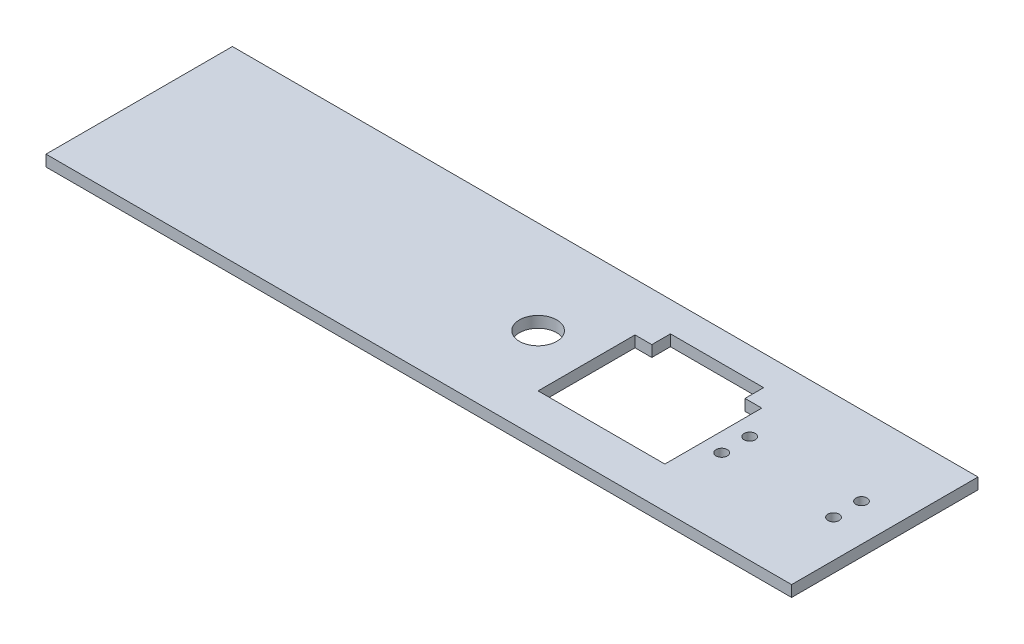
ISO-10303-21;
HEADER;
FILE_DESCRIPTION(('STEP AP214'),'2;1');
FILE_NAME('part.step','',(''),(''),'','','');
FILE_SCHEMA(('AUTOMOTIVE_DESIGN { 1 0 10303 214 1 1 1 1 }'));
ENDSEC;
DATA;
#1=APPLICATION_CONTEXT('core data for automotive mechanical design processes');
#2=APPLICATION_PROTOCOL_DEFINITION('international standard','automotive_design',2000,#1);
#3=PRODUCT_CONTEXT('',#1,'mechanical');
#4=PRODUCT('Part','Part','',(#3));
#5=PRODUCT_RELATED_PRODUCT_CATEGORY('part','',(#4));
#6=PRODUCT_DEFINITION_FORMATION('','',#4);
#7=PRODUCT_DEFINITION_CONTEXT('part definition',#1,'design');
#8=PRODUCT_DEFINITION('design','',#6,#7);
#9=PRODUCT_DEFINITION_SHAPE('','',#8);
#10=(LENGTH_UNIT() NAMED_UNIT(*) SI_UNIT(.MILLI.,.METRE.));
#11=(NAMED_UNIT(*) PLANE_ANGLE_UNIT() SI_UNIT($,.RADIAN.));
#12=(NAMED_UNIT(*) SI_UNIT($,.STERADIAN.) SOLID_ANGLE_UNIT());
#13=UNCERTAINTY_MEASURE_WITH_UNIT(LENGTH_MEASURE(1.E-05),#10,'distance_accuracy_value','');
#14=(GEOMETRIC_REPRESENTATION_CONTEXT(3) GLOBAL_UNCERTAINTY_ASSIGNED_CONTEXT((#13)) GLOBAL_UNIT_ASSIGNED_CONTEXT((#10,
#11,#12)) REPRESENTATION_CONTEXT('',''));
#15=CARTESIAN_POINT('',(0.,0.,0.));
#16=DIRECTION('',(0.,0.,1.));
#17=DIRECTION('',(1.,0.,0.));
#18=AXIS2_PLACEMENT_3D('',#15,#16,#17);
#19=CARTESIAN_POINT('',(26.,-1.5,-12.));
#20=DIRECTION('',(0.,0.,-1.));
#21=DIRECTION('',(-1.,0.,0.));
#22=AXIS2_PLACEMENT_3D('',#19,#20,#21);
#23=PLANE('',#22);
#24=DIRECTION('',(1.,0.,0.));
#25=VECTOR('',#24,1.);
#26=CARTESIAN_POINT('',(0.,1.5,-12.));
#27=LINE('',#26,#25);
#28=CARTESIAN_POINT('',(55.5,1.5,-12.));
#29=VERTEX_POINT('',#28);
#30=CARTESIAN_POINT('',(60.,1.5,-12.));
#31=VERTEX_POINT('',#30);
#32=EDGE_CURVE('E62',#29,#31,#27,.T.);
#33=ORIENTED_EDGE('',*,*,#32,.F.);
#34=DIRECTION('',(0.,1.,0.));
#35=VECTOR('',#34,1.);
#36=CARTESIAN_POINT('',(55.5,-1.5,-12.));
#37=LINE('',#36,#35);
#38=CARTESIAN_POINT('',(55.5,-1.5,-12.));
#39=VERTEX_POINT('',#38);
#40=EDGE_CURVE('E162',#39,#29,#37,.T.);
#41=ORIENTED_EDGE('',*,*,#40,.F.);
#42=DIRECTION('',(-1.,0.,0.));
#43=VECTOR('',#42,1.);
#44=CARTESIAN_POINT('',(26.,-1.5,-12.));
#45=LINE('',#44,#43);
#46=CARTESIAN_POINT('',(60.,-1.5,-12.));
#47=VERTEX_POINT('',#46);
#48=EDGE_CURVE('E156',#47,#39,#45,.T.);
#49=ORIENTED_EDGE('',*,*,#48,.F.);
#50=DIRECTION('',(0.,1.,0.));
#51=VECTOR('',#50,1.);
#52=CARTESIAN_POINT('',(60.,-1.5,-12.));
#53=LINE('',#52,#51);
#54=EDGE_CURVE('E191',#47,#31,#53,.T.);
#55=ORIENTED_EDGE('',*,*,#54,.T.);
#56=EDGE_LOOP('',(#33,#41,#49,#55));
#57=FACE_BOUND('',#56,.T.);
#58=ADVANCED_FACE('F38',(#57),#23,.F.);
#59=CARTESIAN_POINT('',(105.,1.5,25.));
#60=DIRECTION('',(-1.,0.,0.));
#61=DIRECTION('',(0.,0.,1.));
#62=AXIS2_PLACEMENT_3D('',#59,#60,#61);
#63=PLANE('',#62);
#64=DIRECTION('',(0.,0.,-1.));
#65=VECTOR('',#64,1.);
#66=CARTESIAN_POINT('',(105.,-1.5,25.));
#67=LINE('',#66,#65);
#68=CARTESIAN_POINT('',(105.,-1.5,25.));
#69=VERTEX_POINT('',#68);
#70=CARTESIAN_POINT('',(105.,-1.5,-25.));
#71=VERTEX_POINT('',#70);
#72=EDGE_CURVE('E258',#69,#71,#67,.T.);
#73=ORIENTED_EDGE('',*,*,#72,.T.);
#74=DIRECTION('',(0.,-1.,0.));
#75=VECTOR('',#74,1.);
#76=CARTESIAN_POINT('',(105.,1.5,-25.));
#77=LINE('',#76,#75);
#78=CARTESIAN_POINT('',(105.,1.5,-25.));
#79=VERTEX_POINT('',#78);
#80=EDGE_CURVE('E11',#79,#71,#77,.T.);
#81=ORIENTED_EDGE('',*,*,#80,.F.);
#82=DIRECTION('',(0.,0.,-1.));
#83=VECTOR('',#82,1.);
#84=CARTESIAN_POINT('',(105.,1.5,25.));
#85=LINE('',#84,#83);
#86=CARTESIAN_POINT('',(105.,1.5,25.));
#87=VERTEX_POINT('',#86);
#88=EDGE_CURVE('E262',#87,#79,#85,.T.);
#89=ORIENTED_EDGE('',*,*,#88,.F.);
#90=DIRECTION('',(0.,-1.,0.));
#91=VECTOR('',#90,1.);
#92=CARTESIAN_POINT('',(105.,1.5,25.));
#93=LINE('',#92,#91);
#94=EDGE_CURVE('E276',#87,#69,#93,.T.);
#95=ORIENTED_EDGE('',*,*,#94,.T.);
#96=EDGE_LOOP('',(#73,#81,#89,#95));
#97=FACE_BOUND('',#96,.T.);
#98=ADVANCED_FACE('F40',(#97),#63,.F.);
#99=CARTESIAN_POINT('',(-95.,1.5,-25.));
#100=DIRECTION('',(0.,0.,1.));
#101=DIRECTION('',(1.,0.,0.));
#102=AXIS2_PLACEMENT_3D('',#99,#100,#101);
#103=PLANE('',#102);
#104=DIRECTION('',(-1.,0.,0.));
#105=VECTOR('',#104,1.);
#106=CARTESIAN_POINT('',(-95.,-1.5,-25.));
#107=LINE('',#106,#105);
#108=CARTESIAN_POINT('',(-95.,-1.5,-25.));
#109=VERTEX_POINT('',#108);
#110=EDGE_CURVE('E280',#71,#109,#107,.T.);
#111=ORIENTED_EDGE('',*,*,#110,.T.);
#112=DIRECTION('',(0.,-1.,0.));
#113=VECTOR('',#112,1.);
#114=CARTESIAN_POINT('',(-95.,1.5,-25.));
#115=LINE('',#114,#113);
#116=CARTESIAN_POINT('',(-95.,1.5,-25.));
#117=VERTEX_POINT('',#116);
#118=EDGE_CURVE('E47',#117,#109,#115,.T.);
#119=ORIENTED_EDGE('',*,*,#118,.F.);
#120=DIRECTION('',(-1.,0.,0.));
#121=VECTOR('',#120,1.);
#122=CARTESIAN_POINT('',(-95.,1.5,-25.));
#123=LINE('',#122,#121);
#124=EDGE_CURVE('E266',#79,#117,#123,.T.);
#125=ORIENTED_EDGE('',*,*,#124,.F.);
#126=ORIENTED_EDGE('',*,*,#80,.T.);
#127=EDGE_LOOP('',(#111,#119,#125,#126));
#128=FACE_BOUND('',#127,.T.);
#129=ADVANCED_FACE('F315',(#128),#103,.F.);
#130=CARTESIAN_POINT('',(-95.,1.5,25.));
#131=DIRECTION('',(1.,0.,0.));
#132=DIRECTION('',(0.,0.,-1.));
#133=AXIS2_PLACEMENT_3D('',#130,#131,#132);
#134=PLANE('',#133);
#135=DIRECTION('',(0.,0.,1.));
#136=VECTOR('',#135,1.);
#137=CARTESIAN_POINT('',(-95.,-1.5,25.));
#138=LINE('',#137,#136);
#139=CARTESIAN_POINT('',(-95.,-1.5,25.));
#140=VERTEX_POINT('',#139);
#141=EDGE_CURVE('E283',#109,#140,#138,.T.);
#142=ORIENTED_EDGE('',*,*,#141,.T.);
#143=DIRECTION('',(0.,-1.,0.));
#144=VECTOR('',#143,1.);
#145=CARTESIAN_POINT('',(-95.,1.5,25.));
#146=LINE('',#145,#144);
#147=CARTESIAN_POINT('',(-95.,1.5,25.));
#148=VERTEX_POINT('',#147);
#149=EDGE_CURVE('E291',#148,#140,#146,.T.);
#150=ORIENTED_EDGE('',*,*,#149,.F.);
#151=DIRECTION('',(0.,0.,1.));
#152=VECTOR('',#151,1.);
#153=CARTESIAN_POINT('',(-95.,1.5,25.));
#154=LINE('',#153,#152);
#155=EDGE_CURVE('E270',#117,#148,#154,.T.);
#156=ORIENTED_EDGE('',*,*,#155,.F.);
#157=ORIENTED_EDGE('',*,*,#118,.T.);
#158=EDGE_LOOP('',(#142,#150,#156,#157));
#159=FACE_BOUND('',#158,.T.);
#160=ADVANCED_FACE('F300',(#159),#134,.F.);
#161=CARTESIAN_POINT('',(-95.,1.5,25.));
#162=DIRECTION('',(0.,0.,-1.));
#163=DIRECTION('',(-1.,0.,0.));
#164=AXIS2_PLACEMENT_3D('',#161,#162,#163);
#165=PLANE('',#164);
#166=DIRECTION('',(1.,0.,0.));
#167=VECTOR('',#166,1.);
#168=CARTESIAN_POINT('',(-95.,-1.5,25.));
#169=LINE('',#168,#167);
#170=EDGE_CURVE('E267',#140,#69,#169,.T.);
#171=ORIENTED_EDGE('',*,*,#170,.T.);
#172=ORIENTED_EDGE('',*,*,#94,.F.);
#173=DIRECTION('',(1.,0.,0.));
#174=VECTOR('',#173,1.);
#175=CARTESIAN_POINT('',(-95.,1.5,25.));
#176=LINE('',#175,#174);
#177=EDGE_CURVE('E273',#148,#87,#176,.T.);
#178=ORIENTED_EDGE('',*,*,#177,.F.);
#179=ORIENTED_EDGE('',*,*,#149,.T.);
#180=EDGE_LOOP('',(#171,#172,#178,#179));
#181=FACE_BOUND('',#180,.T.);
#182=ADVANCED_FACE('F308',(#181),#165,.F.);
#183=CARTESIAN_POINT('',(0.,1.5,0.));
#184=DIRECTION('',(0.,-1.,0.));
#185=DIRECTION('',(0.,0.,-1.));
#186=AXIS2_PLACEMENT_3D('',#183,#184,#185);
#187=PLANE('',#186);
#188=DIRECTION('',(1.,0.,0.));
#189=VECTOR('',#188,1.);
#190=CARTESIAN_POINT('',(0.,1.5,-17.));
#191=LINE('',#190,#189);
#192=CARTESIAN_POINT('',(30.5,1.5,-17.));
#193=VERTEX_POINT('',#192);
#194=CARTESIAN_POINT('',(55.5,1.5,-17.));
#195=VERTEX_POINT('',#194);
#196=EDGE_CURVE('E174',#193,#195,#191,.T.);
#197=ORIENTED_EDGE('',*,*,#196,.T.);
#198=DIRECTION('',(0.,0.,1.));
#199=VECTOR('',#198,1.);
#200=CARTESIAN_POINT('',(55.5,1.5,0.));
#201=LINE('',#200,#199);
#202=EDGE_CURVE('E136',#195,#29,#201,.T.);
#203=ORIENTED_EDGE('',*,*,#202,.T.);
#204=ORIENTED_EDGE('',*,*,#32,.T.);
#205=DIRECTION('',(0.,0.,1.));
#206=VECTOR('',#205,1.);
#207=CARTESIAN_POINT('',(60.,1.5,0.));
#208=LINE('',#207,#206);
#209=CARTESIAN_POINT('',(60.,1.5,14.));
#210=VERTEX_POINT('',#209);
#211=EDGE_CURVE('E218',#31,#210,#208,.T.);
#212=ORIENTED_EDGE('',*,*,#211,.T.);
#213=DIRECTION('',(-1.,0.,0.));
#214=VECTOR('',#213,1.);
#215=CARTESIAN_POINT('',(0.,1.5,14.));
#216=LINE('',#215,#214);
#217=CARTESIAN_POINT('',(26.,1.5,14.));
#218=VERTEX_POINT('',#217);
#219=EDGE_CURVE('E214',#210,#218,#216,.T.);
#220=ORIENTED_EDGE('',*,*,#219,.T.);
#221=DIRECTION('',(0.,0.,-1.));
#222=VECTOR('',#221,1.);
#223=CARTESIAN_POINT('',(26.,1.5,0.));
#224=LINE('',#223,#222);
#225=CARTESIAN_POINT('',(26.,1.5,-12.));
#226=VERTEX_POINT('',#225);
#227=EDGE_CURVE('E210',#218,#226,#224,.T.);
#228=ORIENTED_EDGE('',*,*,#227,.T.);
#229=CARTESIAN_POINT('',(30.5,1.5,-12.));
#230=VERTEX_POINT('',#229);
#231=EDGE_CURVE('E206',#226,#230,#27,.T.);
#232=ORIENTED_EDGE('',*,*,#231,.T.);
#233=DIRECTION('',(0.,0.,-1.));
#234=VECTOR('',#233,1.);
#235=CARTESIAN_POINT('',(30.5,1.5,0.));
#236=LINE('',#235,#234);
#237=EDGE_CURVE('E54',#230,#193,#236,.T.);
#238=ORIENTED_EDGE('',*,*,#237,.T.);
#239=EDGE_LOOP('',(#197,#203,#204,#212,#220,#228,#232,#238));
#240=FACE_BOUND('',#239,.T.);
#241=CARTESIAN_POINT('',(65.,1.5,3.75000000000001));
#242=DIRECTION('',(0.,-1.,0.));
#243=DIRECTION('',(0.,0.,-1.));
#244=AXIS2_PLACEMENT_3D('',#241,#242,#243);
#245=CIRCLE('',#244,1.5);
#246=CARTESIAN_POINT('',(65.,1.5,2.25000000000001));
#247=VERTEX_POINT('',#246);
#248=EDGE_CURVE('E249',#247,#247,#245,.T.);
#249=ORIENTED_EDGE('',*,*,#248,.T.);
#250=EDGE_LOOP('',(#249));
#251=FACE_BOUND('',#250,.T.);
#252=CARTESIAN_POINT('',(95.,1.5,3.75));
#253=DIRECTION('',(0.,-1.,0.));
#254=DIRECTION('',(0.,0.,-1.));
#255=AXIS2_PLACEMENT_3D('',#252,#253,#254);
#256=CIRCLE('',#255,1.5);
#257=CARTESIAN_POINT('',(95.,1.5,2.25));
#258=VERTEX_POINT('',#257);
#259=EDGE_CURVE('E245',#258,#258,#256,.T.);
#260=ORIENTED_EDGE('',*,*,#259,.T.);
#261=EDGE_LOOP('',(#260));
#262=FACE_BOUND('',#261,.T.);
#263=CARTESIAN_POINT('',(95.,1.5,-3.75));
#264=DIRECTION('',(0.,-1.,0.));
#265=DIRECTION('',(0.,0.,-1.));
#266=AXIS2_PLACEMENT_3D('',#263,#264,#265);
#267=CIRCLE('',#266,1.5);
#268=CARTESIAN_POINT('',(95.,1.5,-5.25));
#269=VERTEX_POINT('',#268);
#270=EDGE_CURVE('E241',#269,#269,#267,.T.);
#271=ORIENTED_EDGE('',*,*,#270,.T.);
#272=EDGE_LOOP('',(#271));
#273=FACE_BOUND('',#272,.T.);
#274=CARTESIAN_POINT('',(65.,1.5,-3.75));
#275=DIRECTION('',(0.,-1.,0.));
#276=DIRECTION('',(0.,0.,-1.));
#277=AXIS2_PLACEMENT_3D('',#274,#275,#276);
#278=CIRCLE('',#277,1.5);
#279=CARTESIAN_POINT('',(65.,1.5,-5.25));
#280=VERTEX_POINT('',#279);
#281=EDGE_CURVE('E237',#280,#280,#278,.T.);
#282=ORIENTED_EDGE('',*,*,#281,.T.);
#283=EDGE_LOOP('',(#282));
#284=FACE_BOUND('',#283,.T.);
#285=CARTESIAN_POINT('',(12.,1.5,0.));
#286=DIRECTION('',(0.,1.,0.));
#287=DIRECTION('',(0.,0.,1.));
#288=AXIS2_PLACEMENT_3D('',#285,#286,#287);
#289=CIRCLE('',#288,5.);
#290=CARTESIAN_POINT('',(12.,1.5,5.));
#291=VERTEX_POINT('',#290);
#292=EDGE_CURVE('E253',#291,#291,#289,.T.);
#293=ORIENTED_EDGE('',*,*,#292,.F.);
#294=EDGE_LOOP('',(#293));
#295=FACE_BOUND('',#294,.T.);
#296=ORIENTED_EDGE('',*,*,#88,.T.);
#297=ORIENTED_EDGE('',*,*,#124,.T.);
#298=ORIENTED_EDGE('',*,*,#155,.T.);
#299=ORIENTED_EDGE('',*,*,#177,.T.);
#300=EDGE_LOOP('',(#296,#297,#298,#299));
#301=FACE_BOUND('',#300,.T.);
#302=ADVANCED_FACE('F314',(#240,#251,#262,#273,#284,#295,#301),#187,.F.);
#303=CARTESIAN_POINT('',(0.,-1.5,0.));
#304=DIRECTION('',(0.,-1.,0.));
#305=DIRECTION('',(0.,0.,-1.));
#306=AXIS2_PLACEMENT_3D('',#303,#304,#305);
#307=PLANE('',#306);
#308=DIRECTION('',(0.,0.,-1.));
#309=VECTOR('',#308,1.);
#310=CARTESIAN_POINT('',(55.5,-1.5,-17.));
#311=LINE('',#310,#309);
#312=CARTESIAN_POINT('',(55.5,-1.5,-17.));
#313=VERTEX_POINT('',#312);
#314=EDGE_CURVE('E134',#39,#313,#311,.T.);
#315=ORIENTED_EDGE('',*,*,#314,.T.);
#316=DIRECTION('',(-1.,0.,0.));
#317=VECTOR('',#316,1.);
#318=CARTESIAN_POINT('',(55.5,-1.5,-17.));
#319=LINE('',#318,#317);
#320=CARTESIAN_POINT('',(30.5,-1.5,-17.));
#321=VERTEX_POINT('',#320);
#322=EDGE_CURVE('E144',#313,#321,#319,.T.);
#323=ORIENTED_EDGE('',*,*,#322,.T.);
#324=DIRECTION('',(0.,0.,1.));
#325=VECTOR('',#324,1.);
#326=CARTESIAN_POINT('',(30.5,-1.5,-17.));
#327=LINE('',#326,#325);
#328=CARTESIAN_POINT('',(30.5,-1.5,-12.));
#329=VERTEX_POINT('',#328);
#330=EDGE_CURVE('E141',#321,#329,#327,.T.);
#331=ORIENTED_EDGE('',*,*,#330,.T.);
#332=CARTESIAN_POINT('',(26.,-1.5,-12.));
#333=VERTEX_POINT('',#332);
#334=EDGE_CURVE('E180',#329,#333,#45,.T.);
#335=ORIENTED_EDGE('',*,*,#334,.T.);
#336=DIRECTION('',(0.,0.,1.));
#337=VECTOR('',#336,1.);
#338=CARTESIAN_POINT('',(26.,-1.5,14.));
#339=LINE('',#338,#337);
#340=CARTESIAN_POINT('',(26.,-1.5,14.));
#341=VERTEX_POINT('',#340);
#342=EDGE_CURVE('E183',#333,#341,#339,.T.);
#343=ORIENTED_EDGE('',*,*,#342,.T.);
#344=DIRECTION('',(1.,0.,0.));
#345=VECTOR('',#344,1.);
#346=CARTESIAN_POINT('',(60.,-1.5,14.));
#347=LINE('',#346,#345);
#348=CARTESIAN_POINT('',(60.,-1.5,14.));
#349=VERTEX_POINT('',#348);
#350=EDGE_CURVE('E187',#341,#349,#347,.T.);
#351=ORIENTED_EDGE('',*,*,#350,.T.);
#352=DIRECTION('',(0.,0.,-1.));
#353=VECTOR('',#352,1.);
#354=CARTESIAN_POINT('',(60.,-1.5,14.));
#355=LINE('',#354,#353);
#356=EDGE_CURVE('E177',#349,#47,#355,.T.);
#357=ORIENTED_EDGE('',*,*,#356,.T.);
#358=ORIENTED_EDGE('',*,*,#48,.T.);
#359=EDGE_LOOP('',(#315,#323,#331,#335,#343,#351,#357,#358));
#360=FACE_BOUND('',#359,.T.);
#361=CARTESIAN_POINT('',(65.,-1.5,3.75000000000001));
#362=DIRECTION('',(0.,1.,0.));
#363=DIRECTION('',(0.,0.,-1.));
#364=AXIS2_PLACEMENT_3D('',#361,#362,#363);
#365=CIRCLE('',#364,1.5);
#366=CARTESIAN_POINT('',(65.,-1.5,2.25000000000001));
#367=VERTEX_POINT('',#366);
#368=EDGE_CURVE('E221',#367,#367,#365,.T.);
#369=ORIENTED_EDGE('',*,*,#368,.T.);
#370=EDGE_LOOP('',(#369));
#371=FACE_BOUND('',#370,.T.);
#372=CARTESIAN_POINT('',(95.,-1.5,3.75));
#373=DIRECTION('',(0.,1.,0.));
#374=DIRECTION('',(0.,0.,-1.));
#375=AXIS2_PLACEMENT_3D('',#372,#373,#374);
#376=CIRCLE('',#375,1.5);
#377=CARTESIAN_POINT('',(95.,-1.5,2.25));
#378=VERTEX_POINT('',#377);
#379=EDGE_CURVE('E227',#378,#378,#376,.T.);
#380=ORIENTED_EDGE('',*,*,#379,.T.);
#381=EDGE_LOOP('',(#380));
#382=FACE_BOUND('',#381,.T.);
#383=CARTESIAN_POINT('',(95.,-1.5,-3.75));
#384=DIRECTION('',(0.,1.,0.));
#385=DIRECTION('',(0.,0.,1.));
#386=AXIS2_PLACEMENT_3D('',#383,#384,#385);
#387=CIRCLE('',#386,1.5);
#388=CARTESIAN_POINT('',(95.,-1.5,-2.25));
#389=VERTEX_POINT('',#388);
#390=EDGE_CURVE('E222',#389,#389,#387,.T.);
#391=ORIENTED_EDGE('',*,*,#390,.T.);
#392=EDGE_LOOP('',(#391));
#393=FACE_BOUND('',#392,.T.);
#394=CARTESIAN_POINT('',(65.,-1.5,-3.75));
#395=DIRECTION('',(0.,1.,0.));
#396=DIRECTION('',(0.,0.,1.));
#397=AXIS2_PLACEMENT_3D('',#394,#395,#396);
#398=CIRCLE('',#397,1.5);
#399=CARTESIAN_POINT('',(65.,-1.5,-2.25));
#400=VERTEX_POINT('',#399);
#401=EDGE_CURVE('E226',#400,#400,#398,.T.);
#402=ORIENTED_EDGE('',*,*,#401,.T.);
#403=EDGE_LOOP('',(#402));
#404=FACE_BOUND('',#403,.T.);
#405=CARTESIAN_POINT('',(12.,-1.5,0.));
#406=DIRECTION('',(0.,1.,0.));
#407=DIRECTION('',(0.,0.,1.));
#408=AXIS2_PLACEMENT_3D('',#405,#406,#407);
#409=CIRCLE('',#408,5.);
#410=CARTESIAN_POINT('',(12.,-1.5,5.));
#411=VERTEX_POINT('',#410);
#412=EDGE_CURVE('E254',#411,#411,#409,.T.);
#413=ORIENTED_EDGE('',*,*,#412,.T.);
#414=EDGE_LOOP('',(#413));
#415=FACE_BOUND('',#414,.T.);
#416=ORIENTED_EDGE('',*,*,#72,.F.);
#417=ORIENTED_EDGE('',*,*,#170,.F.);
#418=ORIENTED_EDGE('',*,*,#141,.F.);
#419=ORIENTED_EDGE('',*,*,#110,.F.);
#420=EDGE_LOOP('',(#416,#417,#418,#419));
#421=FACE_BOUND('',#420,.T.);
#422=ADVANCED_FACE('F152',(#360,#371,#382,#393,#404,#415,#421),#307,.T.);
#423=CARTESIAN_POINT('',(12.,-1.5,0.));
#424=DIRECTION('',(0.,1.,0.));
#425=DIRECTION('',(0.,0.,1.));
#426=AXIS2_PLACEMENT_3D('',#423,#424,#425);
#427=CYLINDRICAL_SURFACE('',#426,5.);
#428=ORIENTED_EDGE('',*,*,#412,.F.);
#429=EDGE_LOOP('',(#428));
#430=FACE_BOUND('',#429,.T.);
#431=ORIENTED_EDGE('',*,*,#292,.T.);
#432=EDGE_LOOP('',(#431));
#433=FACE_BOUND('',#432,.T.);
#434=ADVANCED_FACE('F386',(#430,#433),#427,.F.);
#435=CARTESIAN_POINT('',(65.,-1.5,-3.75));
#436=DIRECTION('',(0.,1.,0.));
#437=DIRECTION('',(0.,0.,1.));
#438=AXIS2_PLACEMENT_3D('',#435,#436,#437);
#439=CYLINDRICAL_SURFACE('',#438,1.5);
#440=ORIENTED_EDGE('',*,*,#401,.F.);
#441=EDGE_LOOP('',(#440));
#442=FACE_BOUND('',#441,.T.);
#443=ORIENTED_EDGE('',*,*,#281,.F.);
#444=EDGE_LOOP('',(#443));
#445=FACE_BOUND('',#444,.T.);
#446=ADVANCED_FACE('F379',(#442,#445),#439,.F.);
#447=CARTESIAN_POINT('',(95.,-1.5,-3.75));
#448=DIRECTION('',(0.,1.,0.));
#449=DIRECTION('',(0.,0.,1.));
#450=AXIS2_PLACEMENT_3D('',#447,#448,#449);
#451=CYLINDRICAL_SURFACE('',#450,1.5);
#452=ORIENTED_EDGE('',*,*,#390,.F.);
#453=EDGE_LOOP('',(#452));
#454=FACE_BOUND('',#453,.T.);
#455=ORIENTED_EDGE('',*,*,#270,.F.);
#456=EDGE_LOOP('',(#455));
#457=FACE_BOUND('',#456,.T.);
#458=ADVANCED_FACE('F376',(#454,#457),#451,.F.);
#459=CARTESIAN_POINT('',(95.,-1.5,3.75));
#460=DIRECTION('',(0.,1.,0.));
#461=DIRECTION('',(0.,0.,1.));
#462=AXIS2_PLACEMENT_3D('',#459,#460,#461);
#463=CYLINDRICAL_SURFACE('',#462,1.5);
#464=ORIENTED_EDGE('',*,*,#379,.F.);
#465=EDGE_LOOP('',(#464));
#466=FACE_BOUND('',#465,.T.);
#467=ORIENTED_EDGE('',*,*,#259,.F.);
#468=EDGE_LOOP('',(#467));
#469=FACE_BOUND('',#468,.T.);
#470=ADVANCED_FACE('F372',(#466,#469),#463,.F.);
#471=CARTESIAN_POINT('',(65.,-1.5,3.75000000000001));
#472=DIRECTION('',(0.,1.,0.));
#473=DIRECTION('',(0.,0.,1.));
#474=AXIS2_PLACEMENT_3D('',#471,#472,#473);
#475=CYLINDRICAL_SURFACE('',#474,1.5);
#476=ORIENTED_EDGE('',*,*,#368,.F.);
#477=EDGE_LOOP('',(#476));
#478=FACE_BOUND('',#477,.T.);
#479=ORIENTED_EDGE('',*,*,#248,.F.);
#480=EDGE_LOOP('',(#479));
#481=FACE_BOUND('',#480,.T.);
#482=ADVANCED_FACE('F368',(#478,#481),#475,.F.);
#483=CARTESIAN_POINT('',(60.,-1.5,14.));
#484=DIRECTION('',(1.,0.,0.));
#485=DIRECTION('',(0.,0.,-1.));
#486=AXIS2_PLACEMENT_3D('',#483,#484,#485);
#487=PLANE('',#486);
#488=ORIENTED_EDGE('',*,*,#54,.F.);
#489=ORIENTED_EDGE('',*,*,#356,.F.);
#490=DIRECTION('',(0.,1.,0.));
#491=VECTOR('',#490,1.);
#492=CARTESIAN_POINT('',(60.,-1.5,14.));
#493=LINE('',#492,#491);
#494=EDGE_CURVE('E192',#349,#210,#493,.T.);
#495=ORIENTED_EDGE('',*,*,#494,.T.);
#496=ORIENTED_EDGE('',*,*,#211,.F.);
#497=EDGE_LOOP('',(#488,#489,#495,#496));
#498=FACE_BOUND('',#497,.T.);
#499=ADVANCED_FACE('F353',(#498),#487,.F.);
#500=CARTESIAN_POINT('',(60.,-1.5,14.));
#501=DIRECTION('',(0.,0.,1.));
#502=DIRECTION('',(1.,0.,0.));
#503=AXIS2_PLACEMENT_3D('',#500,#501,#502);
#504=PLANE('',#503);
#505=ORIENTED_EDGE('',*,*,#494,.F.);
#506=ORIENTED_EDGE('',*,*,#350,.F.);
#507=DIRECTION('',(0.,1.,0.));
#508=VECTOR('',#507,1.);
#509=CARTESIAN_POINT('',(26.,-1.5,14.));
#510=LINE('',#509,#508);
#511=EDGE_CURVE('E196',#341,#218,#510,.T.);
#512=ORIENTED_EDGE('',*,*,#511,.T.);
#513=ORIENTED_EDGE('',*,*,#219,.F.);
#514=EDGE_LOOP('',(#505,#506,#512,#513));
#515=FACE_BOUND('',#514,.T.);
#516=ADVANCED_FACE('F342',(#515),#504,.F.);
#517=CARTESIAN_POINT('',(26.,-1.5,14.));
#518=DIRECTION('',(-1.,0.,0.));
#519=DIRECTION('',(0.,0.,1.));
#520=AXIS2_PLACEMENT_3D('',#517,#518,#519);
#521=PLANE('',#520);
#522=ORIENTED_EDGE('',*,*,#511,.F.);
#523=ORIENTED_EDGE('',*,*,#342,.F.);
#524=DIRECTION('',(0.,1.,0.));
#525=VECTOR('',#524,1.);
#526=CARTESIAN_POINT('',(26.,-1.5,-12.));
#527=LINE('',#526,#525);
#528=EDGE_CURVE('E200',#333,#226,#527,.T.);
#529=ORIENTED_EDGE('',*,*,#528,.T.);
#530=ORIENTED_EDGE('',*,*,#227,.F.);
#531=EDGE_LOOP('',(#522,#523,#529,#530));
#532=FACE_BOUND('',#531,.T.);
#533=ADVANCED_FACE('F333',(#532),#521,.F.);
#534=ORIENTED_EDGE('',*,*,#334,.F.);
#535=DIRECTION('',(0.,1.,0.));
#536=VECTOR('',#535,1.);
#537=CARTESIAN_POINT('',(30.5,-1.5,-12.));
#538=LINE('',#537,#536);
#539=EDGE_CURVE('E165',#329,#230,#538,.T.);
#540=ORIENTED_EDGE('',*,*,#539,.T.);
#541=ORIENTED_EDGE('',*,*,#231,.F.);
#542=ORIENTED_EDGE('',*,*,#528,.F.);
#543=EDGE_LOOP('',(#534,#540,#541,#542));
#544=FACE_BOUND('',#543,.T.);
#545=ADVANCED_FACE('F325',(#544),#23,.F.);
#546=CARTESIAN_POINT('',(55.5,-1.5,-17.));
#547=DIRECTION('',(0.,0.,-1.));
#548=DIRECTION('',(-1.,0.,0.));
#549=AXIS2_PLACEMENT_3D('',#546,#547,#548);
#550=PLANE('',#549);
#551=DIRECTION('',(0.,1.,0.));
#552=VECTOR('',#551,1.);
#553=CARTESIAN_POINT('',(30.5,-1.5,-17.));
#554=LINE('',#553,#552);
#555=EDGE_CURVE('E140',#321,#193,#554,.T.);
#556=ORIENTED_EDGE('',*,*,#555,.F.);
#557=ORIENTED_EDGE('',*,*,#322,.F.);
#558=DIRECTION('',(0.,1.,0.));
#559=VECTOR('',#558,1.);
#560=CARTESIAN_POINT('',(55.5,-1.5,-17.));
#561=LINE('',#560,#559);
#562=EDGE_CURVE('E130',#313,#195,#561,.T.);
#563=ORIENTED_EDGE('',*,*,#562,.T.);
#564=ORIENTED_EDGE('',*,*,#196,.F.);
#565=EDGE_LOOP('',(#556,#557,#563,#564));
#566=FACE_BOUND('',#565,.T.);
#567=ADVANCED_FACE('F145',(#566),#550,.F.);
#568=CARTESIAN_POINT('',(55.5,-1.5,-17.));
#569=DIRECTION('',(1.,0.,0.));
#570=DIRECTION('',(0.,0.,-1.));
#571=AXIS2_PLACEMENT_3D('',#568,#569,#570);
#572=PLANE('',#571);
#573=ORIENTED_EDGE('',*,*,#562,.F.);
#574=ORIENTED_EDGE('',*,*,#314,.F.);
#575=ORIENTED_EDGE('',*,*,#40,.T.);
#576=ORIENTED_EDGE('',*,*,#202,.F.);
#577=EDGE_LOOP('',(#573,#574,#575,#576));
#578=FACE_BOUND('',#577,.T.);
#579=ADVANCED_FACE('F132',(#578),#572,.F.);
#580=CARTESIAN_POINT('',(30.5,-1.5,-17.));
#581=DIRECTION('',(-1.,0.,0.));
#582=DIRECTION('',(0.,0.,1.));
#583=AXIS2_PLACEMENT_3D('',#580,#581,#582);
#584=PLANE('',#583);
#585=ORIENTED_EDGE('',*,*,#539,.F.);
#586=ORIENTED_EDGE('',*,*,#330,.F.);
#587=ORIENTED_EDGE('',*,*,#555,.T.);
#588=ORIENTED_EDGE('',*,*,#237,.F.);
#589=EDGE_LOOP('',(#585,#586,#587,#588));
#590=FACE_BOUND('',#589,.T.);
#591=ADVANCED_FACE('F356',(#590),#584,.F.);
#592=CLOSED_SHELL('',(#58,#98,#129,#160,#182,#302,#422,#434,#446,#458,#470,#482,#499,#516,#533,
#545,#567,#579,#591));
#593=MANIFOLD_SOLID_BREP('B2',#592);
#594=ADVANCED_BREP_SHAPE_REPRESENTATION('',(#18,#593),#14);
#595=SHAPE_DEFINITION_REPRESENTATION(#9,#594);
ENDSEC;
END-ISO-10303-21;
